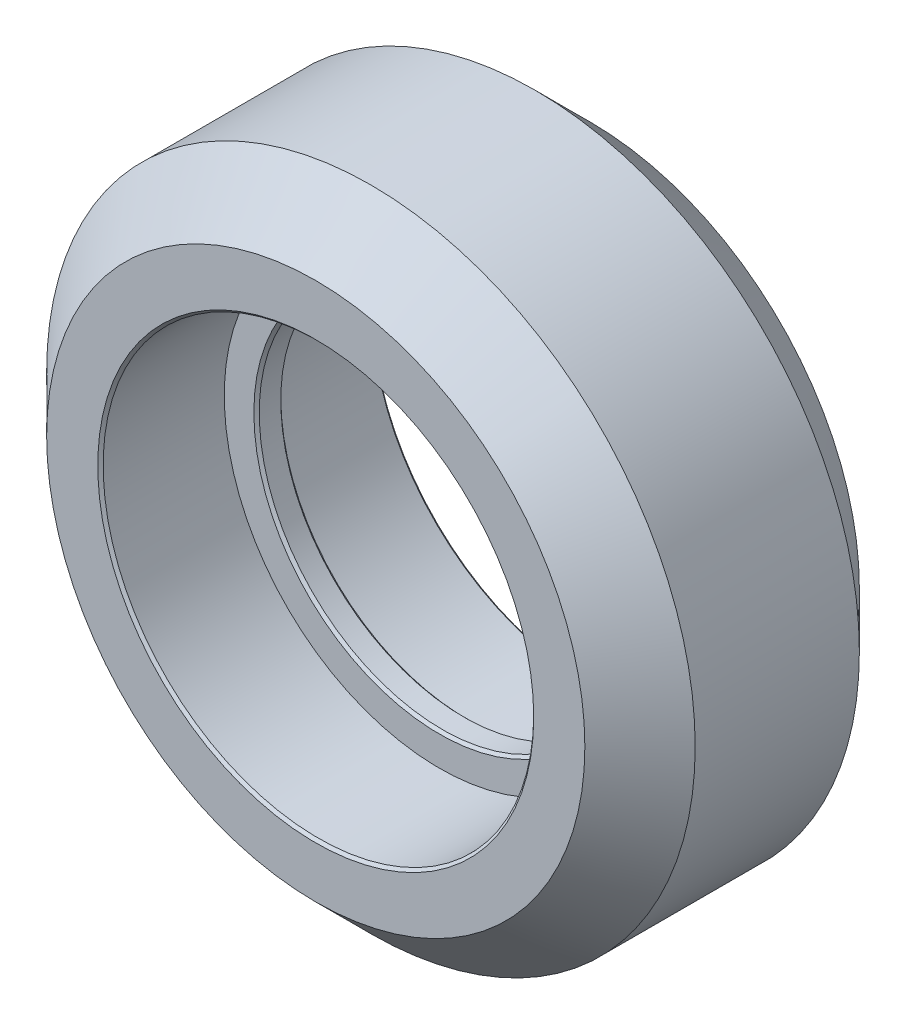
ISO-10303-21;
HEADER;
FILE_DESCRIPTION(('STEP AP214'),'2;1');
FILE_NAME('part.step','',(''),(''),'','','');
FILE_SCHEMA(('AUTOMOTIVE_DESIGN { 1 0 10303 214 1 1 1 1 }'));
ENDSEC;
DATA;
#1=APPLICATION_CONTEXT('core data for automotive mechanical design processes');
#2=APPLICATION_PROTOCOL_DEFINITION('international standard','automotive_design',2000,#1);
#3=PRODUCT_CONTEXT('',#1,'mechanical');
#4=PRODUCT('Part','Part','',(#3));
#5=PRODUCT_RELATED_PRODUCT_CATEGORY('part','',(#4));
#6=PRODUCT_DEFINITION_FORMATION('','',#4);
#7=PRODUCT_DEFINITION_CONTEXT('part definition',#1,'design');
#8=PRODUCT_DEFINITION('design','',#6,#7);
#9=PRODUCT_DEFINITION_SHAPE('','',#8);
#10=(LENGTH_UNIT() NAMED_UNIT(*) SI_UNIT(.MILLI.,.METRE.));
#11=(NAMED_UNIT(*) PLANE_ANGLE_UNIT() SI_UNIT($,.RADIAN.));
#12=(NAMED_UNIT(*) SI_UNIT($,.STERADIAN.) SOLID_ANGLE_UNIT());
#13=UNCERTAINTY_MEASURE_WITH_UNIT(LENGTH_MEASURE(1.E-05),#10,'distance_accuracy_value','');
#14=(GEOMETRIC_REPRESENTATION_CONTEXT(3) GLOBAL_UNCERTAINTY_ASSIGNED_CONTEXT((#13)) GLOBAL_UNIT_ASSIGNED_CONTEXT((#10,
#11,#12)) REPRESENTATION_CONTEXT('',''));
#15=CARTESIAN_POINT('',(0.,0.,0.));
#16=DIRECTION('',(0.,0.,1.));
#17=DIRECTION('',(1.,0.,0.));
#18=AXIS2_PLACEMENT_3D('',#15,#16,#17);
#19=CARTESIAN_POINT('',(23.5,-35.5,-13.9500000000332));
#20=DIRECTION('',(0.,0.,-1.));
#21=DIRECTION('',(-1.,0.,0.));
#22=AXIS2_PLACEMENT_3D('',#19,#20,#21);
#23=PLANE('',#22);
#24=CARTESIAN_POINT('',(15.5,-35.5,-13.9500000000332));
#25=DIRECTION('',(0.,0.,1.));
#26=DIRECTION('',(1.,0.,0.));
#27=AXIS2_PLACEMENT_3D('',#24,#25,#26);
#28=CIRCLE('',#27,6.90000000000464);
#29=CARTESIAN_POINT('',(22.4000000000046,-35.5,-13.9500000000332));
#30=VERTEX_POINT('',#29);
#31=EDGE_CURVE('E10',#30,#30,#28,.T.);
#32=ORIENTED_EDGE('',*,*,#31,.T.);
#33=EDGE_LOOP('',(#32));
#34=FACE_BOUND('',#33,.T.);
#35=CARTESIAN_POINT('',(15.5,-35.5,-13.9500000000332));
#36=DIRECTION('',(0.,0.,1.));
#37=DIRECTION('',(1.,0.,0.));
#38=AXIS2_PLACEMENT_3D('',#35,#36,#37);
#39=CIRCLE('',#38,8.);
#40=CARTESIAN_POINT('',(23.5,-35.5,-13.9500000000332));
#41=VERTEX_POINT('',#40);
#42=EDGE_CURVE('E80',#41,#41,#39,.T.);
#43=ORIENTED_EDGE('',*,*,#42,.F.);
#44=EDGE_LOOP('',(#43));
#45=FACE_BOUND('',#44,.T.);
#46=ADVANCED_FACE('F34',(#34,#45),#23,.T.);
#47=CARTESIAN_POINT('',(15.5,-35.5,-13.9500000000332));
#48=DIRECTION('',(0.,0.,-1.));
#49=DIRECTION('',(-1.,0.,0.));
#50=AXIS2_PLACEMENT_3D('',#47,#48,#49);
#51=CONICAL_SURFACE('',#50,6.90000000000464,0.785398163397448);
#52=CARTESIAN_POINT('',(15.5,-35.5,-13.8500000000015));
#53=DIRECTION('',(0.,0.,1.));
#54=DIRECTION('',(1.,0.,0.));
#55=AXIS2_PLACEMENT_3D('',#52,#53,#54);
#56=CIRCLE('',#55,6.7999999999729);
#57=CARTESIAN_POINT('',(22.2999999999729,-35.5,-13.8500000000015));
#58=VERTEX_POINT('',#57);
#59=EDGE_CURVE('E40',#58,#58,#56,.T.);
#60=ORIENTED_EDGE('',*,*,#59,.T.);
#61=EDGE_LOOP('',(#60));
#62=FACE_BOUND('',#61,.T.);
#63=ORIENTED_EDGE('',*,*,#31,.F.);
#64=EDGE_LOOP('',(#63));
#65=FACE_BOUND('',#64,.T.);
#66=ADVANCED_FACE('F88',(#62,#65),#51,.F.);
#67=CARTESIAN_POINT('',(15.5,-35.5,-18.55));
#68=DIRECTION('',(0.,0.,1.));
#69=DIRECTION('',(1.,0.,0.));
#70=AXIS2_PLACEMENT_3D('',#67,#68,#69);
#71=CYLINDRICAL_SURFACE('',#70,6.7999999999729);
#72=CARTESIAN_POINT('',(15.5,-35.5,-13.0500000000317));
#73=DIRECTION('',(0.,0.,1.));
#74=DIRECTION('',(1.,0.,0.));
#75=AXIS2_PLACEMENT_3D('',#72,#73,#74);
#76=CIRCLE('',#75,6.7999999999729);
#77=CARTESIAN_POINT('',(22.2999999999729,-35.5,-13.0500000000317));
#78=VERTEX_POINT('',#77);
#79=EDGE_CURVE('E44',#78,#78,#76,.T.);
#80=ORIENTED_EDGE('',*,*,#79,.T.);
#81=EDGE_LOOP('',(#80));
#82=FACE_BOUND('',#81,.T.);
#83=ORIENTED_EDGE('',*,*,#59,.F.);
#84=EDGE_LOOP('',(#83));
#85=FACE_BOUND('',#84,.T.);
#86=ADVANCED_FACE('F92',(#82,#85),#71,.F.);
#87=CARTESIAN_POINT('',(15.5,-35.5,-13.0500000000317));
#88=DIRECTION('',(0.,0.,1.));
#89=DIRECTION('',(1.,0.,0.));
#90=AXIS2_PLACEMENT_3D('',#87,#88,#89);
#91=CONICAL_SURFACE('',#90,6.7999999999729,0.785398163397448);
#92=CARTESIAN_POINT('',(15.5,-35.5,-12.95));
#93=DIRECTION('',(0.,0.,1.));
#94=DIRECTION('',(1.,0.,0.));
#95=AXIS2_PLACEMENT_3D('',#92,#93,#94);
#96=CIRCLE('',#95,6.90000000000464);
#97=CARTESIAN_POINT('',(22.4000000000046,-35.5,-12.95));
#98=VERTEX_POINT('',#97);
#99=EDGE_CURVE('E48',#98,#98,#96,.T.);
#100=ORIENTED_EDGE('',*,*,#99,.T.);
#101=EDGE_LOOP('',(#100));
#102=FACE_BOUND('',#101,.T.);
#103=ORIENTED_EDGE('',*,*,#79,.F.);
#104=EDGE_LOOP('',(#103));
#105=FACE_BOUND('',#104,.T.);
#106=ADVANCED_FACE('F96',(#102,#105),#91,.F.);
#107=CARTESIAN_POINT('',(22.4000000000046,-35.5,-12.95));
#108=DIRECTION('',(0.,0.,1.));
#109=DIRECTION('',(1.,0.,0.));
#110=AXIS2_PLACEMENT_3D('',#107,#108,#109);
#111=PLANE('',#110);
#112=CARTESIAN_POINT('',(15.5,-35.5,-12.95));
#113=DIRECTION('',(0.,0.,1.));
#114=DIRECTION('',(1.,0.,0.));
#115=AXIS2_PLACEMENT_3D('',#112,#113,#114);
#116=CIRCLE('',#115,8.);
#117=CARTESIAN_POINT('',(23.5,-35.5,-12.95));
#118=VERTEX_POINT('',#117);
#119=EDGE_CURVE('E53',#118,#118,#116,.T.);
#120=ORIENTED_EDGE('',*,*,#119,.T.);
#121=EDGE_LOOP('',(#120));
#122=FACE_BOUND('',#121,.T.);
#123=ORIENTED_EDGE('',*,*,#99,.F.);
#124=EDGE_LOOP('',(#123));
#125=FACE_BOUND('',#124,.T.);
#126=ADVANCED_FACE('F103',(#122,#125),#111,.T.);
#127=CARTESIAN_POINT('',(15.5,-35.5,-18.55));
#128=DIRECTION('',(0.,0.,1.));
#129=DIRECTION('',(1.,0.,0.));
#130=AXIS2_PLACEMENT_3D('',#127,#128,#129);
#131=CYLINDRICAL_SURFACE('',#130,8.);
#132=CARTESIAN_POINT('',(15.5,-35.5,-8.45));
#133=DIRECTION('',(0.,0.,1.));
#134=DIRECTION('',(1.,0.,0.));
#135=AXIS2_PLACEMENT_3D('',#132,#133,#134);
#136=CIRCLE('',#135,8.);
#137=CARTESIAN_POINT('',(23.5,-35.5,-8.45));
#138=VERTEX_POINT('',#137);
#139=EDGE_CURVE('E56',#138,#138,#136,.T.);
#140=ORIENTED_EDGE('',*,*,#139,.T.);
#141=EDGE_LOOP('',(#140));
#142=FACE_BOUND('',#141,.T.);
#143=ORIENTED_EDGE('',*,*,#119,.F.);
#144=EDGE_LOOP('',(#143));
#145=FACE_BOUND('',#144,.T.);
#146=ADVANCED_FACE('F107',(#142,#145),#131,.F.);
#147=CARTESIAN_POINT('',(15.5,-35.5,-8.45));
#148=DIRECTION('',(0.,0.,1.));
#149=DIRECTION('',(1.,0.,0.));
#150=AXIS2_PLACEMENT_3D('',#147,#148,#149);
#151=CONICAL_SURFACE('',#150,8.,0.785398163397448);
#152=CARTESIAN_POINT('',(15.5,-35.5,-8.35));
#153=DIRECTION('',(0.,0.,1.));
#154=DIRECTION('',(1.,0.,0.));
#155=AXIS2_PLACEMENT_3D('',#152,#153,#154);
#156=CIRCLE('',#155,8.1);
#157=CARTESIAN_POINT('',(23.6,-35.5,-8.35));
#158=VERTEX_POINT('',#157);
#159=EDGE_CURVE('E59',#158,#158,#156,.T.);
#160=ORIENTED_EDGE('',*,*,#159,.T.);
#161=EDGE_LOOP('',(#160));
#162=FACE_BOUND('',#161,.T.);
#163=ORIENTED_EDGE('',*,*,#139,.F.);
#164=EDGE_LOOP('',(#163));
#165=FACE_BOUND('',#164,.T.);
#166=ADVANCED_FACE('F111',(#162,#165),#151,.F.);
#167=CARTESIAN_POINT('',(23.6,-35.5,-8.35));
#168=DIRECTION('',(0.,0.,1.));
#169=DIRECTION('',(1.,0.,0.));
#170=AXIS2_PLACEMENT_3D('',#167,#168,#169);
#171=PLANE('',#170);
#172=CARTESIAN_POINT('',(15.5,-35.5,-8.35));
#173=DIRECTION('',(0.,0.,1.));
#174=DIRECTION('',(1.,0.,0.));
#175=AXIS2_PLACEMENT_3D('',#172,#173,#174);
#176=CIRCLE('',#175,10.);
#177=CARTESIAN_POINT('',(25.5,-35.5,-8.35));
#178=VERTEX_POINT('',#177);
#179=EDGE_CURVE('E62',#178,#178,#176,.T.);
#180=ORIENTED_EDGE('',*,*,#179,.T.);
#181=EDGE_LOOP('',(#180));
#182=FACE_BOUND('',#181,.T.);
#183=ORIENTED_EDGE('',*,*,#159,.F.);
#184=EDGE_LOOP('',(#183));
#185=FACE_BOUND('',#184,.T.);
#186=ADVANCED_FACE('F115',(#182,#185),#171,.T.);
#187=CARTESIAN_POINT('',(15.5,-35.5,-8.35));
#188=DIRECTION('',(0.,0.,-1.));
#189=DIRECTION('',(-1.,0.,0.));
#190=AXIS2_PLACEMENT_3D('',#187,#188,#189);
#191=CONICAL_SURFACE('',#190,10.,0.785398163397447);
#192=CARTESIAN_POINT('',(15.5,-35.5,-10.4));
#193=DIRECTION('',(0.,0.,1.));
#194=DIRECTION('',(1.,0.,0.));
#195=AXIS2_PLACEMENT_3D('',#192,#193,#194);
#196=CIRCLE('',#195,12.05);
#197=CARTESIAN_POINT('',(27.55,-35.5,-10.4));
#198=VERTEX_POINT('',#197);
#199=EDGE_CURVE('E65',#198,#198,#196,.T.);
#200=ORIENTED_EDGE('',*,*,#199,.T.);
#201=EDGE_LOOP('',(#200));
#202=FACE_BOUND('',#201,.T.);
#203=ORIENTED_EDGE('',*,*,#179,.F.);
#204=EDGE_LOOP('',(#203));
#205=FACE_BOUND('',#204,.T.);
#206=ADVANCED_FACE('F119',(#202,#205),#191,.T.);
#207=CARTESIAN_POINT('',(15.5,-35.5,-18.55));
#208=DIRECTION('',(0.,0.,1.));
#209=DIRECTION('',(1.,0.,0.));
#210=AXIS2_PLACEMENT_3D('',#207,#208,#209);
#211=CYLINDRICAL_SURFACE('',#210,12.05);
#212=CARTESIAN_POINT('',(15.5,-35.5,-16.5));
#213=DIRECTION('',(0.,0.,1.));
#214=DIRECTION('',(1.,0.,0.));
#215=AXIS2_PLACEMENT_3D('',#212,#213,#214);
#216=CIRCLE('',#215,12.05);
#217=CARTESIAN_POINT('',(27.55,-35.5,-16.5));
#218=VERTEX_POINT('',#217);
#219=EDGE_CURVE('E68',#218,#218,#216,.T.);
#220=ORIENTED_EDGE('',*,*,#219,.T.);
#221=EDGE_LOOP('',(#220));
#222=FACE_BOUND('',#221,.T.);
#223=ORIENTED_EDGE('',*,*,#199,.F.);
#224=EDGE_LOOP('',(#223));
#225=FACE_BOUND('',#224,.T.);
#226=ADVANCED_FACE('F123',(#222,#225),#211,.T.);
#227=CARTESIAN_POINT('',(15.5,-35.5,-16.5));
#228=DIRECTION('',(0.,0.,1.));
#229=DIRECTION('',(1.,0.,0.));
#230=AXIS2_PLACEMENT_3D('',#227,#228,#229);
#231=CONICAL_SURFACE('',#230,12.05,0.785398163397449);
#232=CARTESIAN_POINT('',(15.5,-35.5,-18.55));
#233=DIRECTION('',(0.,0.,1.));
#234=DIRECTION('',(1.,0.,0.));
#235=AXIS2_PLACEMENT_3D('',#232,#233,#234);
#236=CIRCLE('',#235,10.);
#237=CARTESIAN_POINT('',(25.5,-35.5,-18.55));
#238=VERTEX_POINT('',#237);
#239=EDGE_CURVE('E71',#238,#238,#236,.T.);
#240=ORIENTED_EDGE('',*,*,#239,.T.);
#241=EDGE_LOOP('',(#240));
#242=FACE_BOUND('',#241,.T.);
#243=ORIENTED_EDGE('',*,*,#219,.F.);
#244=EDGE_LOOP('',(#243));
#245=FACE_BOUND('',#244,.T.);
#246=ADVANCED_FACE('F127',(#242,#245),#231,.T.);
#247=CARTESIAN_POINT('',(25.5,-35.5,-18.55));
#248=DIRECTION('',(0.,0.,-1.));
#249=DIRECTION('',(-1.,0.,0.));
#250=AXIS2_PLACEMENT_3D('',#247,#248,#249);
#251=PLANE('',#250);
#252=CARTESIAN_POINT('',(15.5,-35.5,-18.55));
#253=DIRECTION('',(0.,0.,1.));
#254=DIRECTION('',(1.,0.,0.));
#255=AXIS2_PLACEMENT_3D('',#252,#253,#254);
#256=CIRCLE('',#255,8.1);
#257=CARTESIAN_POINT('',(23.6,-35.5,-18.55));
#258=VERTEX_POINT('',#257);
#259=EDGE_CURVE('E74',#258,#258,#256,.T.);
#260=ORIENTED_EDGE('',*,*,#259,.T.);
#261=EDGE_LOOP('',(#260));
#262=FACE_BOUND('',#261,.T.);
#263=ORIENTED_EDGE('',*,*,#239,.F.);
#264=EDGE_LOOP('',(#263));
#265=FACE_BOUND('',#264,.T.);
#266=ADVANCED_FACE('F131',(#262,#265),#251,.T.);
#267=CARTESIAN_POINT('',(15.5,-35.5,-18.55));
#268=DIRECTION('',(0.,0.,-1.));
#269=DIRECTION('',(-1.,0.,0.));
#270=AXIS2_PLACEMENT_3D('',#267,#268,#269);
#271=CONICAL_SURFACE('',#270,8.1,0.785398163397431);
#272=CARTESIAN_POINT('',(15.5,-35.5,-18.45));
#273=DIRECTION('',(0.,0.,1.));
#274=DIRECTION('',(1.,0.,0.));
#275=AXIS2_PLACEMENT_3D('',#272,#273,#274);
#276=CIRCLE('',#275,8.);
#277=CARTESIAN_POINT('',(23.5,-35.5,-18.45));
#278=VERTEX_POINT('',#277);
#279=EDGE_CURVE('E77',#278,#278,#276,.T.);
#280=ORIENTED_EDGE('',*,*,#279,.T.);
#281=EDGE_LOOP('',(#280));
#282=FACE_BOUND('',#281,.T.);
#283=ORIENTED_EDGE('',*,*,#259,.F.);
#284=EDGE_LOOP('',(#283));
#285=FACE_BOUND('',#284,.T.);
#286=ADVANCED_FACE('F135',(#282,#285),#271,.F.);
#287=CARTESIAN_POINT('',(15.5,-35.5,-18.55));
#288=DIRECTION('',(0.,0.,1.));
#289=DIRECTION('',(1.,0.,0.));
#290=AXIS2_PLACEMENT_3D('',#287,#288,#289);
#291=CYLINDRICAL_SURFACE('',#290,8.);
#292=ORIENTED_EDGE('',*,*,#42,.T.);
#293=EDGE_LOOP('',(#292));
#294=FACE_BOUND('',#293,.T.);
#295=ORIENTED_EDGE('',*,*,#279,.F.);
#296=EDGE_LOOP('',(#295));
#297=FACE_BOUND('',#296,.T.);
#298=ADVANCED_FACE('F84',(#294,#297),#291,.F.);
#299=CLOSED_SHELL('',(#46,#66,#86,#106,#126,#146,#166,#186,#206,#226,#246,#266,#286,#298));
#300=MANIFOLD_SOLID_BREP('B2',#299);
#301=ADVANCED_BREP_SHAPE_REPRESENTATION('',(#18,#300),#14);
#302=SHAPE_DEFINITION_REPRESENTATION(#9,#301);
ENDSEC;
END-ISO-10303-21;
